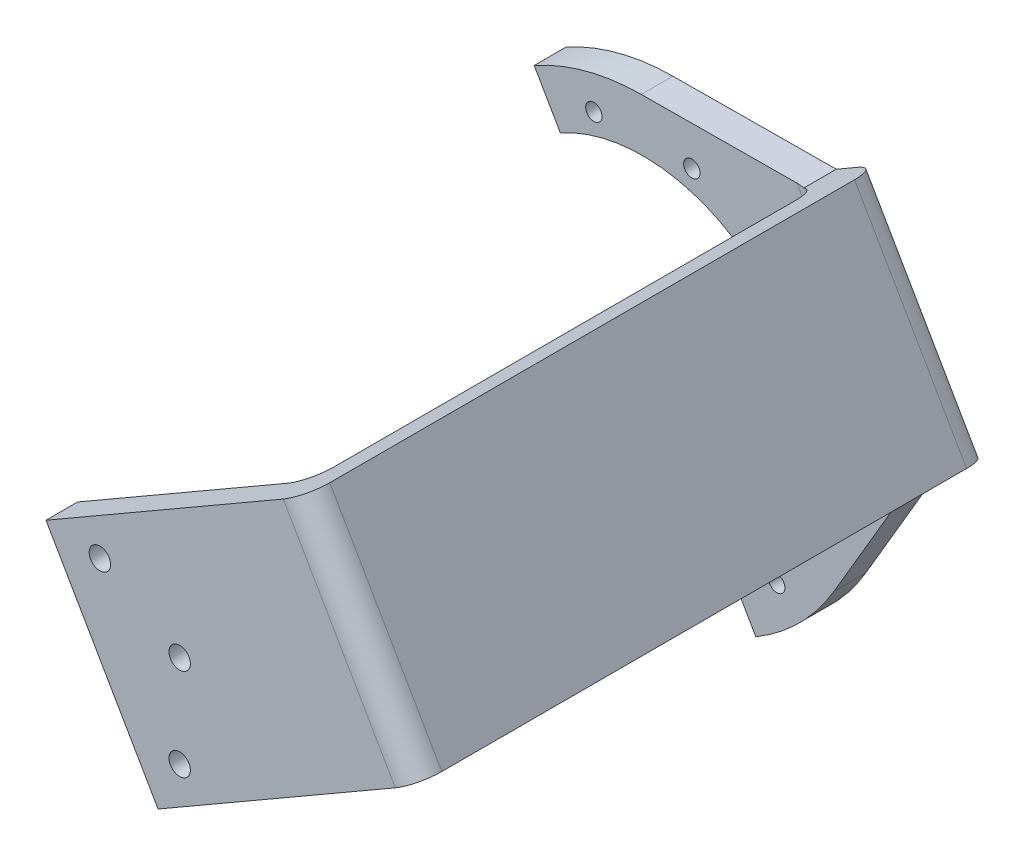
ISO-10303-21;
HEADER;
FILE_DESCRIPTION(('STEP AP214'),'2;1');
FILE_NAME('part.step','',(''),(''),'','','');
FILE_SCHEMA(('AUTOMOTIVE_DESIGN { 1 0 10303 214 1 1 1 1 }'));
ENDSEC;
DATA;
#1=APPLICATION_CONTEXT('core data for automotive mechanical design processes');
#2=APPLICATION_PROTOCOL_DEFINITION('international standard','automotive_design',2000,#1);
#3=PRODUCT_CONTEXT('',#1,'mechanical');
#4=PRODUCT('Part','Part','',(#3));
#5=PRODUCT_RELATED_PRODUCT_CATEGORY('part','',(#4));
#6=PRODUCT_DEFINITION_FORMATION('','',#4);
#7=PRODUCT_DEFINITION_CONTEXT('part definition',#1,'design');
#8=PRODUCT_DEFINITION('design','',#6,#7);
#9=PRODUCT_DEFINITION_SHAPE('','',#8);
#10=(LENGTH_UNIT() NAMED_UNIT(*) SI_UNIT(.MILLI.,.METRE.));
#11=(NAMED_UNIT(*) PLANE_ANGLE_UNIT() SI_UNIT($,.RADIAN.));
#12=(NAMED_UNIT(*) SI_UNIT($,.STERADIAN.) SOLID_ANGLE_UNIT());
#13=UNCERTAINTY_MEASURE_WITH_UNIT(LENGTH_MEASURE(1.E-05),#10,'distance_accuracy_value','');
#14=(GEOMETRIC_REPRESENTATION_CONTEXT(3) GLOBAL_UNCERTAINTY_ASSIGNED_CONTEXT((#13)) GLOBAL_UNIT_ASSIGNED_CONTEXT((#10,
#11,#12)) REPRESENTATION_CONTEXT('',''));
#15=CARTESIAN_POINT('',(0.,0.,0.));
#16=DIRECTION('',(0.,0.,1.));
#17=DIRECTION('',(1.,0.,0.));
#18=AXIS2_PLACEMENT_3D('',#15,#16,#17);
#19=CARTESIAN_POINT('',(0.433012701892224,0.250000000000003,115.35));
#20=DIRECTION('',(0.866025403784438,0.500000000000001,0.));
#21=DIRECTION('',(-0.500000000000001,0.866025403784438,0.));
#22=AXIS2_PLACEMENT_3D('',#19,#20,#21);
#23=PLANE('',#22);
#24=DIRECTION('',(0.500000000000001,-0.866025403784438,0.));
#25=VECTOR('',#24,1.);
#26=CARTESIAN_POINT('',(0.433012701892224,0.250000000000003,109.));
#27=LINE('',#26,#25);
#28=CARTESIAN_POINT('',(-10.8142091773098,19.7307597387781,109.));
#29=VERTEX_POINT('',#28);
#30=CARTESIAN_POINT('',(11.6802345810942,-19.2307597387781,109.));
#31=VERTEX_POINT('',#30);
#32=EDGE_CURVE('E310',#29,#31,#27,.T.);
#33=ORIENTED_EDGE('',*,*,#32,.T.);
#34=DIRECTION('',(0.,0.,-1.));
#35=VECTOR('',#34,1.);
#36=CARTESIAN_POINT('',(11.6802345810942,-19.2307597387781,115.35));
#37=LINE('',#36,#35);
#38=CARTESIAN_POINT('',(11.6802345810942,-19.2307597387781,115.35));
#39=VERTEX_POINT('',#38);
#40=EDGE_CURVE('E304',#39,#31,#37,.T.);
#41=ORIENTED_EDGE('',*,*,#40,.F.);
#42=DIRECTION('',(0.500000000000001,-0.866025403784438,0.));
#43=VECTOR('',#42,1.);
#44=CARTESIAN_POINT('',(0.433012701892224,0.250000000000003,115.35));
#45=LINE('',#44,#43);
#46=CARTESIAN_POINT('',(-10.8142091773098,19.7307597387781,115.35));
#47=VERTEX_POINT('',#46);
#48=EDGE_CURVE('E299',#47,#39,#45,.T.);
#49=ORIENTED_EDGE('',*,*,#48,.F.);
#50=DIRECTION('',(0.,0.,-1.));
#51=VECTOR('',#50,1.);
#52=CARTESIAN_POINT('',(-10.8142091773098,19.7307597387781,115.35));
#53=LINE('',#52,#51);
#54=EDGE_CURVE('E316',#47,#29,#53,.T.);
#55=ORIENTED_EDGE('',*,*,#54,.T.);
#56=EDGE_LOOP('',(#33,#41,#49,#55));
#57=FACE_BOUND('',#56,.T.);
#58=ADVANCED_FACE('F43',(#57),#23,.F.);
#59=CARTESIAN_POINT('',(0.,18.5,115.35));
#60=DIRECTION('',(0.,0.,-1.));
#61=DIRECTION('',(-1.,0.,0.));
#62=AXIS2_PLACEMENT_3D('',#59,#60,#61);
#63=CYLINDRICAL_SURFACE('',#62,2.15);
#64=CARTESIAN_POINT('',(0.,18.5,115.35));
#65=DIRECTION('',(0.,0.,1.));
#66=DIRECTION('',(1.,0.,0.));
#67=AXIS2_PLACEMENT_3D('',#64,#65,#66);
#68=CIRCLE('',#67,2.15);
#69=CARTESIAN_POINT('',(2.15,18.5,115.35));
#70=VERTEX_POINT('',#69);
#71=EDGE_CURVE('E295',#70,#70,#68,.T.);
#72=ORIENTED_EDGE('',*,*,#71,.T.);
#73=EDGE_LOOP('',(#72));
#74=FACE_BOUND('',#73,.T.);
#75=CARTESIAN_POINT('',(0.,18.5,109.));
#76=DIRECTION('',(0.,0.,1.));
#77=DIRECTION('',(1.,0.,0.));
#78=AXIS2_PLACEMENT_3D('',#75,#76,#77);
#79=CIRCLE('',#78,2.15);
#80=CARTESIAN_POINT('',(2.15,18.5,109.));
#81=VERTEX_POINT('',#80);
#82=EDGE_CURVE('E307',#81,#81,#79,.T.);
#83=ORIENTED_EDGE('',*,*,#82,.F.);
#84=EDGE_LOOP('',(#83));
#85=FACE_BOUND('',#84,.T.);
#86=ADVANCED_FACE('F436',(#74,#85),#63,.F.);
#87=CARTESIAN_POINT('',(16.0214699700121,9.25000000000002,115.35));
#88=DIRECTION('',(0.,0.,-1.));
#89=DIRECTION('',(-1.,0.,0.));
#90=AXIS2_PLACEMENT_3D('',#87,#88,#89);
#91=CYLINDRICAL_SURFACE('',#90,2.14999999999999);
#92=CARTESIAN_POINT('',(16.0214699700121,9.25000000000002,115.35));
#93=DIRECTION('',(0.,0.,1.));
#94=DIRECTION('',(1.,0.,0.));
#95=AXIS2_PLACEMENT_3D('',#92,#93,#94);
#96=CIRCLE('',#95,2.14999999999999);
#97=CARTESIAN_POINT('',(18.1714699700121,9.25000000000002,115.35));
#98=VERTEX_POINT('',#97);
#99=EDGE_CURVE('E292',#98,#98,#96,.T.);
#100=ORIENTED_EDGE('',*,*,#99,.T.);
#101=EDGE_LOOP('',(#100));
#102=FACE_BOUND('',#101,.T.);
#103=CARTESIAN_POINT('',(16.0214699700121,9.25000000000002,109.));
#104=DIRECTION('',(0.,0.,1.));
#105=DIRECTION('',(1.,0.,0.));
#106=AXIS2_PLACEMENT_3D('',#103,#104,#105);
#107=CIRCLE('',#106,2.14999999999999);
#108=CARTESIAN_POINT('',(18.1714699700121,9.25000000000002,109.));
#109=VERTEX_POINT('',#108);
#110=EDGE_CURVE('E288',#109,#109,#107,.T.);
#111=ORIENTED_EDGE('',*,*,#110,.F.);
#112=EDGE_LOOP('',(#111));
#113=FACE_BOUND('',#112,.T.);
#114=ADVANCED_FACE('F441',(#102,#113),#91,.F.);
#115=CARTESIAN_POINT('',(16.0214699700121,-9.25000000000002,115.35));
#116=DIRECTION('',(0.,0.,-1.));
#117=DIRECTION('',(-1.,0.,0.));
#118=AXIS2_PLACEMENT_3D('',#115,#116,#117);
#119=CYLINDRICAL_SURFACE('',#118,2.15);
#120=CARTESIAN_POINT('',(16.0214699700121,-9.25000000000002,115.35));
#121=DIRECTION('',(0.,0.,1.));
#122=DIRECTION('',(1.,0.,0.));
#123=AXIS2_PLACEMENT_3D('',#120,#121,#122);
#124=CIRCLE('',#123,2.15);
#125=CARTESIAN_POINT('',(18.1714699700121,-9.25000000000002,115.35));
#126=VERTEX_POINT('',#125);
#127=EDGE_CURVE('E301',#126,#126,#124,.T.);
#128=ORIENTED_EDGE('',*,*,#127,.T.);
#129=EDGE_LOOP('',(#128));
#130=FACE_BOUND('',#129,.T.);
#131=CARTESIAN_POINT('',(16.0214699700121,-9.25000000000002,109.));
#132=DIRECTION('',(0.,0.,1.));
#133=DIRECTION('',(1.,0.,0.));
#134=AXIS2_PLACEMENT_3D('',#131,#132,#133);
#135=CIRCLE('',#134,2.15);
#136=CARTESIAN_POINT('',(18.1714699700121,-9.25000000000002,109.));
#137=VERTEX_POINT('',#136);
#138=EDGE_CURVE('E296',#137,#137,#135,.T.);
#139=ORIENTED_EDGE('',*,*,#138,.F.);
#140=EDGE_LOOP('',(#139));
#141=FACE_BOUND('',#140,.T.);
#142=ADVANCED_FACE('F445',(#130,#141),#119,.F.);
#143=CARTESIAN_POINT('',(0.,0.,115.35));
#144=DIRECTION('',(0.,0.,1.));
#145=DIRECTION('',(1.,0.,0.));
#146=AXIS2_PLACEMENT_3D('',#143,#144,#145);
#147=PLANE('',#146);
#148=ORIENTED_EDGE('',*,*,#99,.F.);
#149=EDGE_LOOP('',(#148));
#150=FACE_BOUND('',#149,.T.);
#151=ORIENTED_EDGE('',*,*,#71,.F.);
#152=EDGE_LOOP('',(#151));
#153=FACE_BOUND('',#152,.T.);
#154=DIRECTION('',(0.866025403784438,0.500000000000002,0.));
#155=VECTOR('',#154,1.);
#156=CARTESIAN_POINT('',(11.247221879202,-19.4807597387781,115.35));
#157=LINE('',#156,#155);
#158=CARTESIAN_POINT('',(59.3116317892383,8.26924026122196,115.35));
#159=VERTEX_POINT('',#158);
#160=EDGE_CURVE('E282',#39,#159,#157,.T.);
#161=ORIENTED_EDGE('',*,*,#160,.T.);
#162=DIRECTION('',(0.500000000000002,-0.866025403784438,0.));
#163=VECTOR('',#162,1.);
#164=CARTESIAN_POINT('',(48.0644099100363,27.7500000000001,115.35));
#165=LINE('',#164,#163);
#166=CARTESIAN_POINT('',(36.8171880308343,47.2307597387782,115.35));
#167=VERTEX_POINT('',#166);
#168=EDGE_CURVE('E328',#159,#167,#165,.F.);
#169=ORIENTED_EDGE('',*,*,#168,.T.);
#170=DIRECTION('',(-0.866025403784438,-0.500000000000001,0.));
#171=VECTOR('',#170,1.);
#172=CARTESIAN_POINT('',(-11.247221879202,19.4807597387781,115.35));
#173=LINE('',#172,#171);
#174=EDGE_CURVE('E285',#167,#47,#173,.T.);
#175=ORIENTED_EDGE('',*,*,#174,.T.);
#176=ORIENTED_EDGE('',*,*,#48,.T.);
#177=EDGE_LOOP('',(#161,#169,#175,#176));
#178=FACE_BOUND('',#177,.T.);
#179=ORIENTED_EDGE('',*,*,#127,.F.);
#180=EDGE_LOOP('',(#179));
#181=FACE_BOUND('',#180,.T.);
#182=ADVANCED_FACE('F386',(#150,#153,#178,#181),#147,.T.);
#183=CARTESIAN_POINT('',(0.,0.,109.));
#184=DIRECTION('',(0.,0.,1.));
#185=DIRECTION('',(1.,0.,0.));
#186=AXIS2_PLACEMENT_3D('',#183,#184,#185);
#187=PLANE('',#186);
#188=ORIENTED_EDGE('',*,*,#110,.T.);
#189=EDGE_LOOP('',(#188));
#190=FACE_BOUND('',#189,.T.);
#191=ORIENTED_EDGE('',*,*,#82,.T.);
#192=EDGE_LOOP('',(#191));
#193=FACE_BOUND('',#192,.T.);
#194=DIRECTION('',(-0.866025403784438,-0.500000000000001,0.));
#195=VECTOR('',#194,1.);
#196=CARTESIAN_POINT('',(-11.247221879202,19.4807597387781,109.));
#197=LINE('',#196,#195);
#198=CARTESIAN_POINT('',(31.3179267168031,44.0557597387782,109.));
#199=VERTEX_POINT('',#198);
#200=EDGE_CURVE('E286',#199,#29,#197,.T.);
#201=ORIENTED_EDGE('',*,*,#200,.F.);
#202=DIRECTION('',(0.500000000000002,-0.866025403784438,0.));
#203=VECTOR('',#202,1.);
#204=CARTESIAN_POINT('',(42.5651485960051,24.5750000000001,109.));
#205=LINE('',#204,#203);
#206=CARTESIAN_POINT('',(53.8123704752072,5.09424026122196,109.));
#207=VERTEX_POINT('',#206);
#208=EDGE_CURVE('E334',#199,#207,#205,.T.);
#209=ORIENTED_EDGE('',*,*,#208,.T.);
#210=DIRECTION('',(0.866025403784438,0.500000000000002,0.));
#211=VECTOR('',#210,1.);
#212=CARTESIAN_POINT('',(11.247221879202,-19.4807597387781,109.));
#213=LINE('',#212,#211);
#214=EDGE_CURVE('E273',#31,#207,#213,.T.);
#215=ORIENTED_EDGE('',*,*,#214,.F.);
#216=ORIENTED_EDGE('',*,*,#32,.F.);
#217=EDGE_LOOP('',(#201,#209,#215,#216));
#218=FACE_BOUND('',#217,.T.);
#219=ORIENTED_EDGE('',*,*,#138,.T.);
#220=EDGE_LOOP('',(#219));
#221=FACE_BOUND('',#220,.T.);
#222=ADVANCED_FACE('F375',(#190,#193,#218,#221),#187,.F.);
#223=CARTESIAN_POINT('',(11.247221879202,-19.4807597387781,115.35));
#224=DIRECTION('',(-0.500000000000002,0.866025403784438,0.));
#225=DIRECTION('',(-0.866025403784438,-0.500000000000002,0.));
#226=AXIS2_PLACEMENT_3D('',#223,#224,#225);
#227=PLANE('',#226);
#228=DIRECTION('',(0.,0.,1.));
#229=VECTOR('',#228,1.);
#230=CARTESIAN_POINT('',(63.6417588081605,10.769240261222,115.35));
#231=LINE('',#230,#229);
#232=CARTESIAN_POINT('',(63.6417588081606,10.769240261222,5.00000000000003));
#233=VERTEX_POINT('',#232);
#234=CARTESIAN_POINT('',(63.6417588081605,10.769240261222,110.35));
#235=VERTEX_POINT('',#234);
#236=EDGE_CURVE('E266',#233,#235,#231,.T.);
#237=ORIENTED_EDGE('',*,*,#236,.T.);
#238=CARTESIAN_POINT('',(59.3116317892383,8.26924026122196,110.35));
#239=DIRECTION('',(-0.500000000000002,0.866025403784438,0.));
#240=DIRECTION('',(-0.866025403784438,-0.500000000000002,0.));
#241=AXIS2_PLACEMENT_3D('',#238,#239,#240);
#242=CIRCLE('',#241,5.);
#243=EDGE_CURVE('E326',#235,#159,#242,.F.);
#244=ORIENTED_EDGE('',*,*,#243,.T.);
#245=ORIENTED_EDGE('',*,*,#160,.F.);
#246=ORIENTED_EDGE('',*,*,#40,.T.);
#247=ORIENTED_EDGE('',*,*,#214,.T.);
#248=CARTESIAN_POINT('',(53.8123704752072,5.09424026122196,104.));
#249=DIRECTION('',(-0.500000000000002,0.866025403784438,0.));
#250=DIRECTION('',(-0.866025403784438,-0.500000000000002,0.));
#251=AXIS2_PLACEMENT_3D('',#248,#249,#250);
#252=CIRCLE('',#251,5.);
#253=CARTESIAN_POINT('',(58.1424974941294,7.59424026122196,104.));
#254=VERTEX_POINT('',#253);
#255=EDGE_CURVE('E347',#207,#254,#252,.T.);
#256=ORIENTED_EDGE('',*,*,#255,.T.);
#257=DIRECTION('',(0.,0.,-1.));
#258=VECTOR('',#257,1.);
#259=CARTESIAN_POINT('',(58.1424974941294,7.59424026122197,6.35));
#260=LINE('',#259,#258);
#261=CARTESIAN_POINT('',(58.1424974941294,7.59424026122197,11.35));
#262=VERTEX_POINT('',#261);
#263=EDGE_CURVE('E262',#254,#262,#260,.T.);
#264=ORIENTED_EDGE('',*,*,#263,.T.);
#265=CARTESIAN_POINT('',(53.8123704752072,5.09424026122196,11.35));
#266=DIRECTION('',(-0.500000000000002,0.866025403784438,0.));
#267=DIRECTION('',(-0.866025403784438,-0.500000000000002,0.));
#268=AXIS2_PLACEMENT_3D('',#265,#266,#267);
#269=CIRCLE('',#268,5.);
#270=CARTESIAN_POINT('',(54.9815047703162,5.76924026122195,6.53569838917417));
#271=VERTEX_POINT('',#270);
#272=EDGE_CURVE('E351',#262,#271,#269,.T.);
#273=ORIENTED_EDGE('',*,*,#272,.T.);
#274=DIRECTION('',(0.,0.,-1.));
#275=VECTOR('',#274,1.);
#276=CARTESIAN_POINT('',(54.9815047703162,5.76924026122195,0.));
#277=LINE('',#276,#275);
#278=CARTESIAN_POINT('',(54.9815047703161,5.76924026122195,0.));
#279=VERTEX_POINT('',#278);
#280=EDGE_CURVE('E65',#271,#279,#277,.T.);
#281=ORIENTED_EDGE('',*,*,#280,.T.);
#282=DIRECTION('',(0.866025403784438,0.500000000000002,0.));
#283=VECTOR('',#282,1.);
#284=CARTESIAN_POINT('',(63.6417588081606,10.769240261222,0.));
#285=LINE('',#284,#283);
#286=CARTESIAN_POINT('',(59.3116317892384,8.26924026122197,0.));
#287=VERTEX_POINT('',#286);
#288=EDGE_CURVE('E277',#279,#287,#285,.T.);
#289=ORIENTED_EDGE('',*,*,#288,.T.);
#290=CARTESIAN_POINT('',(59.3116317892384,8.26924026122198,5.));
#291=DIRECTION('',(-0.500000000000002,0.866025403784438,0.));
#292=DIRECTION('',(-0.866025403784438,-0.500000000000002,0.));
#293=AXIS2_PLACEMENT_3D('',#290,#291,#292);
#294=CIRCLE('',#293,5.);
#295=EDGE_CURVE('E324',#287,#233,#294,.F.);
#296=ORIENTED_EDGE('',*,*,#295,.T.);
#297=EDGE_LOOP('',(#237,#244,#245,#246,#247,#256,#264,#273,#281,#289,#296));
#298=FACE_BOUND('',#297,.T.);
#299=ADVANCED_FACE('F383',(#298),#227,.F.);
#300=CARTESIAN_POINT('',(-11.247221879202,19.4807597387781,115.35));
#301=DIRECTION('',(0.500000000000001,-0.866025403784438,0.));
#302=DIRECTION('',(0.866025403784438,0.500000000000001,0.));
#303=AXIS2_PLACEMENT_3D('',#300,#301,#302);
#304=PLANE('',#303);
#305=ORIENTED_EDGE('',*,*,#174,.F.);
#306=CARTESIAN_POINT('',(36.8171880308343,47.2307597387782,110.35));
#307=DIRECTION('',(0.500000000000001,-0.866025403784438,0.));
#308=DIRECTION('',(0.866025403784438,0.500000000000001,0.));
#309=AXIS2_PLACEMENT_3D('',#306,#307,#308);
#310=CIRCLE('',#309,5.);
#311=CARTESIAN_POINT('',(41.1473150497565,49.7307597387782,110.35));
#312=VERTEX_POINT('',#311);
#313=EDGE_CURVE('E332',#167,#312,#310,.F.);
#314=ORIENTED_EDGE('',*,*,#313,.T.);
#315=DIRECTION('',(0.,0.,1.));
#316=VECTOR('',#315,1.);
#317=CARTESIAN_POINT('',(41.1473150497565,49.7307597387782,115.35));
#318=LINE('',#317,#316);
#319=CARTESIAN_POINT('',(41.1473150497565,49.7307597387783,5.00000000000003));
#320=VERTEX_POINT('',#319);
#321=EDGE_CURVE('E270',#320,#312,#318,.T.);
#322=ORIENTED_EDGE('',*,*,#321,.F.);
#323=CARTESIAN_POINT('',(36.8171880308343,47.2307597387782,5.));
#324=DIRECTION('',(0.500000000000001,-0.866025403784438,0.));
#325=DIRECTION('',(0.866025403784438,0.500000000000001,0.));
#326=AXIS2_PLACEMENT_3D('',#323,#324,#325);
#327=CIRCLE('',#326,5.);
#328=CARTESIAN_POINT('',(36.8171880308343,47.2307597387782,0.));
#329=VERTEX_POINT('',#328);
#330=EDGE_CURVE('E330',#320,#329,#327,.F.);
#331=ORIENTED_EDGE('',*,*,#330,.T.);
#332=DIRECTION('',(0.866025403784438,0.500000000000002,0.));
#333=VECTOR('',#332,1.);
#334=CARTESIAN_POINT('',(41.1473150497565,49.7307597387783,0.));
#335=LINE('',#334,#333);
#336=CARTESIAN_POINT('',(32.4870610119121,44.7307597387782,0.));
#337=VERTEX_POINT('',#336);
#338=EDGE_CURVE('E268',#337,#329,#335,.T.);
#339=ORIENTED_EDGE('',*,*,#338,.F.);
#340=DIRECTION('',(0.,0.,-1.));
#341=VECTOR('',#340,1.);
#342=CARTESIAN_POINT('',(32.4870610119121,44.7307597387782,0.));
#343=LINE('',#342,#341);
#344=CARTESIAN_POINT('',(32.4870610119121,44.7307597387782,6.53569838917418));
#345=VERTEX_POINT('',#344);
#346=EDGE_CURVE('E57',#345,#337,#343,.T.);
#347=ORIENTED_EDGE('',*,*,#346,.F.);
#348=CARTESIAN_POINT('',(31.3179267168031,44.0557597387782,11.35));
#349=DIRECTION('',(0.500000000000001,-0.866025403784438,0.));
#350=DIRECTION('',(0.866025403784438,0.500000000000001,0.));
#351=AXIS2_PLACEMENT_3D('',#348,#349,#350);
#352=CIRCLE('',#351,5.);
#353=CARTESIAN_POINT('',(35.6480537357253,46.5557597387782,11.35));
#354=VERTEX_POINT('',#353);
#355=EDGE_CURVE('E11',#345,#354,#352,.T.);
#356=ORIENTED_EDGE('',*,*,#355,.T.);
#357=DIRECTION('',(0.,0.,-1.));
#358=VECTOR('',#357,1.);
#359=CARTESIAN_POINT('',(35.6480537357253,46.5557597387782,6.35));
#360=LINE('',#359,#358);
#361=CARTESIAN_POINT('',(35.6480537357253,46.5557597387782,104.));
#362=VERTEX_POINT('',#361);
#363=EDGE_CURVE('E263',#362,#354,#360,.T.);
#364=ORIENTED_EDGE('',*,*,#363,.F.);
#365=CARTESIAN_POINT('',(31.3179267168031,44.0557597387782,104.));
#366=DIRECTION('',(0.500000000000001,-0.866025403784438,0.));
#367=DIRECTION('',(0.866025403784438,0.500000000000001,0.));
#368=AXIS2_PLACEMENT_3D('',#365,#366,#367);
#369=CIRCLE('',#368,5.);
#370=EDGE_CURVE('E349',#362,#199,#369,.T.);
#371=ORIENTED_EDGE('',*,*,#370,.T.);
#372=ORIENTED_EDGE('',*,*,#200,.T.);
#373=ORIENTED_EDGE('',*,*,#54,.F.);
#374=EDGE_LOOP('',(#305,#314,#322,#331,#339,#347,#356,#364,#371,#372,#373));
#375=FACE_BOUND('',#374,.T.);
#376=ADVANCED_FACE('F362',(#375),#304,.F.);
#377=CARTESIAN_POINT('',(41.1473150497565,49.7307597387782,115.35));
#378=DIRECTION('',(0.866025403784438,0.500000000000002,0.));
#379=DIRECTION('',(-0.500000000000002,0.866025403784438,0.));
#380=AXIS2_PLACEMENT_3D('',#377,#378,#379);
#381=PLANE('',#380);
#382=ORIENTED_EDGE('',*,*,#321,.T.);
#383=DIRECTION('',(0.500000000000002,-0.866025403784438,0.));
#384=VECTOR('',#383,1.);
#385=CARTESIAN_POINT('',(41.1473150497565,49.7307597387782,110.35));
#386=LINE('',#385,#384);
#387=EDGE_CURVE('E321',#312,#235,#386,.T.);
#388=ORIENTED_EDGE('',*,*,#387,.T.);
#389=ORIENTED_EDGE('',*,*,#236,.F.);
#390=DIRECTION('',(0.500000000000002,-0.866025403784438,0.));
#391=VECTOR('',#390,1.);
#392=CARTESIAN_POINT('',(41.1473150497565,49.7307597387783,5.));
#393=LINE('',#392,#391);
#394=EDGE_CURVE('E319',#233,#320,#393,.F.);
#395=ORIENTED_EDGE('',*,*,#394,.T.);
#396=EDGE_LOOP('',(#382,#388,#389,#395));
#397=FACE_BOUND('',#396,.T.);
#398=ADVANCED_FACE('F395',(#397),#381,.T.);
#399=CARTESIAN_POINT('',(41.1473150497565,49.7307597387783,0.));
#400=DIRECTION('',(0.,0.,-1.));
#401=DIRECTION('',(-1.,0.,0.));
#402=AXIS2_PLACEMENT_3D('',#399,#400,#401);
#403=PLANE('',#402);
#404=ORIENTED_EDGE('',*,*,#338,.T.);
#405=DIRECTION('',(0.500000000000002,-0.866025403784438,0.));
#406=VECTOR('',#405,1.);
#407=CARTESIAN_POINT('',(36.8171880308343,47.2307597387782,0.));
#408=LINE('',#407,#406);
#409=EDGE_CURVE('E344',#329,#287,#408,.T.);
#410=ORIENTED_EDGE('',*,*,#409,.T.);
#411=ORIENTED_EDGE('',*,*,#288,.F.);
#412=DIRECTION('',(-0.50610920608183,-0.862469403236555,0.));
#413=VECTOR('',#412,1.);
#414=CARTESIAN_POINT('',(38.3798884440267,-22.5218596706414,0.));
#415=LINE('',#414,#413);
#416=CARTESIAN_POINT('',(38.3798884440267,-22.5218596706415,0.));
#417=VERTEX_POINT('',#416);
#418=EDGE_CURVE('E194',#279,#417,#415,.T.);
#419=ORIENTED_EDGE('',*,*,#418,.T.);
#420=CARTESIAN_POINT('',(0.,0.,0.));
#421=DIRECTION('',(0.,0.,1.));
#422=DIRECTION('',(1.,0.,0.));
#423=AXIS2_PLACEMENT_3D('',#420,#421,#422);
#424=CIRCLE('',#423,44.5);
#425=CARTESIAN_POINT('',(22.6816081631793,-38.2856977359954,0.));
#426=VERTEX_POINT('',#425);
#427=EDGE_CURVE('E180',#426,#417,#424,.T.);
#428=ORIENTED_EDGE('',*,*,#427,.F.);
#429=DIRECTION('',(-0.500000000000001,0.866025403784438,0.));
#430=VECTOR('',#429,1.);
#431=CARTESIAN_POINT('',(0.433012701892228,0.250000000000006,0.));
#432=LINE('',#431,#430);
#433=CARTESIAN_POINT('',(17.4311743672019,-29.1916796395858,0.));
#434=VERTEX_POINT('',#433);
#435=EDGE_CURVE('E181',#426,#434,#432,.T.);
#436=ORIENTED_EDGE('',*,*,#435,.T.);
#437=CARTESIAN_POINT('',(0.,0.,0.));
#438=DIRECTION('',(0.,0.,1.));
#439=DIRECTION('',(1.,0.,0.));
#440=AXIS2_PLACEMENT_3D('',#437,#438,#439);
#441=CIRCLE('',#440,34.);
#442=CARTESIAN_POINT('',(-16.5651489634174,29.6916796395858,0.));
#443=VERTEX_POINT('',#442);
#444=EDGE_CURVE('E250',#434,#443,#441,.T.);
#445=ORIENTED_EDGE('',*,*,#444,.T.);
#446=CARTESIAN_POINT('',(-21.8155827593948,38.7856977359954,0.));
#447=VERTEX_POINT('',#446);
#448=EDGE_CURVE('E176',#443,#447,#432,.T.);
#449=ORIENTED_EDGE('',*,*,#448,.T.);
#450=CARTESIAN_POINT('',(-0.314558393230516,44.4988882222607,0.));
#451=VERTEX_POINT('',#450);
#452=EDGE_CURVE('E167',#451,#447,#424,.T.);
#453=ORIENTED_EDGE('',*,*,#452,.F.);
#454=DIRECTION('',(-0.999975016230577,-0.00706872793776382,0.));
#455=VECTOR('',#454,1.);
#456=CARTESIAN_POINT('',(-0.31455839323049,44.4988882222607,0.));
#457=LINE('',#456,#455);
#458=EDGE_CURVE('E173',#337,#451,#457,.T.);
#459=ORIENTED_EDGE('',*,*,#458,.F.);
#460=EDGE_LOOP('',(#404,#410,#411,#419,#428,#436,#445,#449,#453,#459));
#461=FACE_BOUND('',#460,.T.);
#462=CARTESIAN_POINT('',(-9.83512371389604,36.7051813989845,0.));
#463=DIRECTION('',(0.,0.,1.));
#464=DIRECTION('',(1.,0.,0.));
#465=AXIS2_PLACEMENT_3D('',#462,#463,#464);
#466=CIRCLE('',#465,1.65);
#467=CARTESIAN_POINT('',(-8.18512371389604,36.7051813989845,0.));
#468=VERTEX_POINT('',#467);
#469=EDGE_CURVE('E190',#468,#468,#466,.T.);
#470=ORIENTED_EDGE('',*,*,#469,.T.);
#471=EDGE_LOOP('',(#470));
#472=FACE_BOUND('',#471,.T.);
#473=CARTESIAN_POINT('',(26.870057685089,-26.8700576850886,0.));
#474=DIRECTION('',(0.,0.,1.));
#475=DIRECTION('',(1.,0.,0.));
#476=AXIS2_PLACEMENT_3D('',#473,#474,#475);
#477=CIRCLE('',#476,1.65);
#478=CARTESIAN_POINT('',(28.520057685089,-26.8700576850886,0.));
#479=VERTEX_POINT('',#478);
#480=EDGE_CURVE('E235',#479,#479,#477,.T.);
#481=ORIENTED_EDGE('',*,*,#480,.T.);
#482=EDGE_LOOP('',(#481));
#483=FACE_BOUND('',#482,.T.);
#484=CARTESIAN_POINT('',(36.7051813989847,-9.83512371389555,0.));
#485=DIRECTION('',(0.,0.,1.));
#486=DIRECTION('',(1.,0.,0.));
#487=AXIS2_PLACEMENT_3D('',#484,#485,#486);
#488=CIRCLE('',#487,1.64999999999999);
#489=CARTESIAN_POINT('',(38.3551813989847,-9.83512371389555,0.));
#490=VERTEX_POINT('',#489);
#491=EDGE_CURVE('E238',#490,#490,#488,.T.);
#492=ORIENTED_EDGE('',*,*,#491,.T.);
#493=EDGE_LOOP('',(#492));
#494=FACE_BOUND('',#493,.T.);
#495=CARTESIAN_POINT('',(36.7051813989845,9.83512371389603,0.));
#496=DIRECTION('',(0.,0.,1.));
#497=DIRECTION('',(1.,0.,0.));
#498=AXIS2_PLACEMENT_3D('',#495,#496,#497);
#499=CIRCLE('',#498,1.65);
#500=CARTESIAN_POINT('',(38.3551813989845,9.83512371389603,0.));
#501=VERTEX_POINT('',#500);
#502=EDGE_CURVE('E241',#501,#501,#499,.T.);
#503=ORIENTED_EDGE('',*,*,#502,.T.);
#504=EDGE_LOOP('',(#503));
#505=FACE_BOUND('',#504,.T.);
#506=CARTESIAN_POINT('',(26.8700576850886,26.870057685089,0.));
#507=DIRECTION('',(0.,0.,1.));
#508=DIRECTION('',(1.,0.,0.));
#509=AXIS2_PLACEMENT_3D('',#506,#507,#508);
#510=CIRCLE('',#509,1.65);
#511=CARTESIAN_POINT('',(28.5200576850886,26.870057685089,0.));
#512=VERTEX_POINT('',#511);
#513=EDGE_CURVE('E244',#512,#512,#510,.T.);
#514=ORIENTED_EDGE('',*,*,#513,.T.);
#515=EDGE_LOOP('',(#514));
#516=FACE_BOUND('',#515,.T.);
#517=CARTESIAN_POINT('',(9.83512371389555,36.7051813989847,0.));
#518=DIRECTION('',(0.,0.,1.));
#519=DIRECTION('',(1.,0.,0.));
#520=AXIS2_PLACEMENT_3D('',#517,#518,#519);
#521=CIRCLE('',#520,1.65);
#522=CARTESIAN_POINT('',(11.4851237138955,36.7051813989847,0.));
#523=VERTEX_POINT('',#522);
#524=EDGE_CURVE('E247',#523,#523,#521,.T.);
#525=ORIENTED_EDGE('',*,*,#524,.T.);
#526=EDGE_LOOP('',(#525));
#527=FACE_BOUND('',#526,.T.);
#528=ADVANCED_FACE('F170',(#461,#472,#483,#494,#505,#516,#527),#403,.T.);
#529=CARTESIAN_POINT('',(32.4870610119121,44.7307597387782,6.35));
#530=DIRECTION('',(0.,0.,1.));
#531=DIRECTION('',(1.,0.,0.));
#532=AXIS2_PLACEMENT_3D('',#529,#530,#531);
#533=PLANE('',#532);
#534=DIRECTION('',(-0.50610920608183,-0.862469403236555,0.));
#535=VECTOR('',#534,1.);
#536=CARTESIAN_POINT('',(38.3798884440267,-22.5218596706414,6.35));
#537=LINE('',#536,#535);
#538=CARTESIAN_POINT('',(54.195745752149,4.430214803193,6.35));
#539=VERTEX_POINT('',#538);
#540=CARTESIAN_POINT('',(38.3798884440267,-22.5218596706415,6.35));
#541=VERTEX_POINT('',#540);
#542=EDGE_CURVE('E200',#539,#541,#537,.T.);
#543=ORIENTED_EDGE('',*,*,#542,.F.);
#544=DIRECTION('',(0.500000000000002,-0.866025403784438,0.));
#545=VECTOR('',#544,1.);
#546=CARTESIAN_POINT('',(31.3179267168031,44.0557597387782,6.35));
#547=LINE('',#546,#545);
#548=CARTESIAN_POINT('',(30.9345514398614,44.7197851968072,6.35));
#549=VERTEX_POINT('',#548);
#550=EDGE_CURVE('E342',#539,#549,#547,.F.);
#551=ORIENTED_EDGE('',*,*,#550,.T.);
#552=DIRECTION('',(-0.999975016230577,-0.00706872793776382,0.));
#553=VECTOR('',#552,1.);
#554=CARTESIAN_POINT('',(-0.31455839323049,44.4988882222607,6.35));
#555=LINE('',#554,#553);
#556=CARTESIAN_POINT('',(-0.314558393230516,44.4988882222607,6.35));
#557=VERTEX_POINT('',#556);
#558=EDGE_CURVE('E197',#549,#557,#555,.T.);
#559=ORIENTED_EDGE('',*,*,#558,.T.);
#560=CARTESIAN_POINT('',(0.,0.,6.35));
#561=DIRECTION('',(0.,0.,1.));
#562=DIRECTION('',(1.,0.,0.));
#563=AXIS2_PLACEMENT_3D('',#560,#561,#562);
#564=CIRCLE('',#563,44.5);
#565=CARTESIAN_POINT('',(-21.8155827593948,38.7856977359954,6.35));
#566=VERTEX_POINT('',#565);
#567=EDGE_CURVE('E187',#557,#566,#564,.T.);
#568=ORIENTED_EDGE('',*,*,#567,.T.);
#569=DIRECTION('',(-0.500000000000001,0.866025403784438,0.));
#570=VECTOR('',#569,1.);
#571=CARTESIAN_POINT('',(0.433012701892228,0.250000000000006,6.35));
#572=LINE('',#571,#570);
#573=CARTESIAN_POINT('',(-16.5651489634174,29.6916796395858,6.35));
#574=VERTEX_POINT('',#573);
#575=EDGE_CURVE('E229',#574,#566,#572,.T.);
#576=ORIENTED_EDGE('',*,*,#575,.F.);
#577=CARTESIAN_POINT('',(0.,0.,6.35));
#578=DIRECTION('',(0.,0.,1.));
#579=DIRECTION('',(1.,0.,0.));
#580=AXIS2_PLACEMENT_3D('',#577,#578,#579);
#581=CIRCLE('',#580,34.);
#582=CARTESIAN_POINT('',(17.4311743672019,-29.1916796395858,6.35));
#583=VERTEX_POINT('',#582);
#584=EDGE_CURVE('E223',#583,#574,#581,.T.);
#585=ORIENTED_EDGE('',*,*,#584,.F.);
#586=CARTESIAN_POINT('',(22.6816081631793,-38.2856977359954,6.35));
#587=VERTEX_POINT('',#586);
#588=EDGE_CURVE('E226',#587,#583,#572,.T.);
#589=ORIENTED_EDGE('',*,*,#588,.F.);
#590=EDGE_CURVE('E230',#587,#541,#564,.T.);
#591=ORIENTED_EDGE('',*,*,#590,.T.);
#592=EDGE_LOOP('',(#543,#551,#559,#568,#576,#585,#589,#591));
#593=FACE_BOUND('',#592,.T.);
#594=CARTESIAN_POINT('',(-9.83512371389604,36.7051813989845,6.35));
#595=DIRECTION('',(0.,0.,1.));
#596=DIRECTION('',(1.,0.,0.));
#597=AXIS2_PLACEMENT_3D('',#594,#595,#596);
#598=CIRCLE('',#597,1.65);
#599=CARTESIAN_POINT('',(-8.18512371389604,36.7051813989845,6.35));
#600=VERTEX_POINT('',#599);
#601=EDGE_CURVE('E205',#600,#600,#598,.T.);
#602=ORIENTED_EDGE('',*,*,#601,.F.);
#603=EDGE_LOOP('',(#602));
#604=FACE_BOUND('',#603,.T.);
#605=CARTESIAN_POINT('',(26.870057685089,-26.8700576850886,6.35));
#606=DIRECTION('',(0.,0.,1.));
#607=DIRECTION('',(1.,0.,0.));
#608=AXIS2_PLACEMENT_3D('',#605,#606,#607);
#609=CIRCLE('',#608,1.65);
#610=CARTESIAN_POINT('',(28.520057685089,-26.8700576850886,6.35));
#611=VERTEX_POINT('',#610);
#612=EDGE_CURVE('E208',#611,#611,#609,.T.);
#613=ORIENTED_EDGE('',*,*,#612,.F.);
#614=EDGE_LOOP('',(#613));
#615=FACE_BOUND('',#614,.T.);
#616=CARTESIAN_POINT('',(36.7051813989847,-9.83512371389555,6.35));
#617=DIRECTION('',(0.,0.,1.));
#618=DIRECTION('',(1.,0.,0.));
#619=AXIS2_PLACEMENT_3D('',#616,#617,#618);
#620=CIRCLE('',#619,1.64999999999999);
#621=CARTESIAN_POINT('',(38.3551813989847,-9.83512371389555,6.35));
#622=VERTEX_POINT('',#621);
#623=EDGE_CURVE('E211',#622,#622,#620,.T.);
#624=ORIENTED_EDGE('',*,*,#623,.F.);
#625=EDGE_LOOP('',(#624));
#626=FACE_BOUND('',#625,.T.);
#627=CARTESIAN_POINT('',(36.7051813989845,9.83512371389603,6.35));
#628=DIRECTION('',(0.,0.,1.));
#629=DIRECTION('',(1.,0.,0.));
#630=AXIS2_PLACEMENT_3D('',#627,#628,#629);
#631=CIRCLE('',#630,1.65);
#632=CARTESIAN_POINT('',(38.3551813989845,9.83512371389603,6.35));
#633=VERTEX_POINT('',#632);
#634=EDGE_CURVE('E214',#633,#633,#631,.T.);
#635=ORIENTED_EDGE('',*,*,#634,.F.);
#636=EDGE_LOOP('',(#635));
#637=FACE_BOUND('',#636,.T.);
#638=CARTESIAN_POINT('',(26.8700576850886,26.870057685089,6.35));
#639=DIRECTION('',(0.,0.,1.));
#640=DIRECTION('',(1.,0.,0.));
#641=AXIS2_PLACEMENT_3D('',#638,#639,#640);
#642=CIRCLE('',#641,1.65);
#643=CARTESIAN_POINT('',(28.5200576850886,26.870057685089,6.35));
#644=VERTEX_POINT('',#643);
#645=EDGE_CURVE('E217',#644,#644,#642,.T.);
#646=ORIENTED_EDGE('',*,*,#645,.F.);
#647=EDGE_LOOP('',(#646));
#648=FACE_BOUND('',#647,.T.);
#649=CARTESIAN_POINT('',(9.83512371389555,36.7051813989847,6.35));
#650=DIRECTION('',(0.,0.,1.));
#651=DIRECTION('',(1.,0.,0.));
#652=AXIS2_PLACEMENT_3D('',#649,#650,#651);
#653=CIRCLE('',#652,1.65);
#654=CARTESIAN_POINT('',(11.4851237138955,36.7051813989847,6.35));
#655=VERTEX_POINT('',#654);
#656=EDGE_CURVE('E220',#655,#655,#653,.T.);
#657=ORIENTED_EDGE('',*,*,#656,.F.);
#658=EDGE_LOOP('',(#657));
#659=FACE_BOUND('',#658,.T.);
#660=ADVANCED_FACE('F406',(#593,#604,#615,#626,#637,#648,#659),#533,.T.);
#661=CARTESIAN_POINT('',(35.6480537357253,46.5557597387782,6.35));
#662=DIRECTION('',(-0.866025403784438,-0.500000000000002,0.));
#663=DIRECTION('',(0.500000000000002,-0.866025403784438,0.));
#664=AXIS2_PLACEMENT_3D('',#661,#662,#663);
#665=PLANE('',#664);
#666=ORIENTED_EDGE('',*,*,#263,.F.);
#667=DIRECTION('',(0.500000000000002,-0.866025403784438,0.));
#668=VECTOR('',#667,1.);
#669=CARTESIAN_POINT('',(35.6480537357253,46.5557597387782,104.));
#670=LINE('',#669,#668);
#671=EDGE_CURVE('E340',#254,#362,#670,.F.);
#672=ORIENTED_EDGE('',*,*,#671,.T.);
#673=ORIENTED_EDGE('',*,*,#363,.T.);
#674=DIRECTION('',(0.500000000000002,-0.866025403784438,0.));
#675=VECTOR('',#674,1.);
#676=CARTESIAN_POINT('',(58.1424974941294,7.59424026122195,11.35));
#677=LINE('',#676,#675);
#678=EDGE_CURVE('E337',#354,#262,#677,.T.);
#679=ORIENTED_EDGE('',*,*,#678,.T.);
#680=EDGE_LOOP('',(#666,#672,#673,#679));
#681=FACE_BOUND('',#680,.T.);
#682=ADVANCED_FACE('F366',(#681),#665,.T.);
#683=CARTESIAN_POINT('',(0.,0.,6.35));
#684=DIRECTION('',(0.,0.,-1.));
#685=DIRECTION('',(-1.,0.,0.));
#686=AXIS2_PLACEMENT_3D('',#683,#684,#685);
#687=CYLINDRICAL_SURFACE('',#686,44.5);
#688=DIRECTION('',(0.,0.,-1.));
#689=VECTOR('',#688,1.);
#690=CARTESIAN_POINT('',(38.3798884440267,-22.5218596706414,6.35));
#691=LINE('',#690,#689);
#692=EDGE_CURVE('E191',#541,#417,#691,.T.);
#693=ORIENTED_EDGE('',*,*,#692,.F.);
#694=ORIENTED_EDGE('',*,*,#590,.F.);
#695=DIRECTION('',(0.,0.,-1.));
#696=VECTOR('',#695,1.);
#697=CARTESIAN_POINT('',(22.6816081631793,-38.2856977359954,6.35));
#698=LINE('',#697,#696);
#699=EDGE_CURVE('E258',#587,#426,#698,.T.);
#700=ORIENTED_EDGE('',*,*,#699,.T.);
#701=ORIENTED_EDGE('',*,*,#427,.T.);
#702=EDGE_LOOP('',(#693,#694,#700,#701));
#703=FACE_BOUND('',#702,.T.);
#704=ADVANCED_FACE('F423',(#703),#687,.T.);
#705=CARTESIAN_POINT('',(0.,0.,6.35));
#706=DIRECTION('',(0.,0.,-1.));
#707=DIRECTION('',(-1.,0.,0.));
#708=AXIS2_PLACEMENT_3D('',#705,#706,#707);
#709=CYLINDRICAL_SURFACE('',#708,34.);
#710=ORIENTED_EDGE('',*,*,#444,.F.);
#711=DIRECTION('',(0.,0.,-1.));
#712=VECTOR('',#711,1.);
#713=CARTESIAN_POINT('',(17.4311743672019,-29.1916796395858,6.35));
#714=LINE('',#713,#712);
#715=EDGE_CURVE('E260',#583,#434,#714,.T.);
#716=ORIENTED_EDGE('',*,*,#715,.F.);
#717=ORIENTED_EDGE('',*,*,#584,.T.);
#718=DIRECTION('',(0.,0.,-1.));
#719=VECTOR('',#718,1.);
#720=CARTESIAN_POINT('',(-16.5651489634174,29.6916796395858,6.35));
#721=LINE('',#720,#719);
#722=EDGE_CURVE('E254',#574,#443,#721,.T.);
#723=ORIENTED_EDGE('',*,*,#722,.T.);
#724=EDGE_LOOP('',(#710,#716,#717,#723));
#725=FACE_BOUND('',#724,.T.);
#726=ADVANCED_FACE('F417',(#725),#709,.F.);
#727=CARTESIAN_POINT('',(0.433012701892228,0.250000000000006,6.35));
#728=DIRECTION('',(-0.866025403784438,-0.500000000000001,0.));
#729=DIRECTION('',(0.500000000000001,-0.866025403784438,0.));
#730=AXIS2_PLACEMENT_3D('',#727,#728,#729);
#731=PLANE('',#730);
#732=ORIENTED_EDGE('',*,*,#435,.F.);
#733=ORIENTED_EDGE('',*,*,#699,.F.);
#734=ORIENTED_EDGE('',*,*,#588,.T.);
#735=ORIENTED_EDGE('',*,*,#715,.T.);
#736=EDGE_LOOP('',(#732,#733,#734,#735));
#737=FACE_BOUND('',#736,.T.);
#738=ADVANCED_FACE('F420',(#737),#731,.T.);
#739=ORIENTED_EDGE('',*,*,#567,.F.);
#740=DIRECTION('',(0.,0.,-1.));
#741=VECTOR('',#740,1.);
#742=CARTESIAN_POINT('',(-0.314558393230516,44.4988882222607,6.35));
#743=LINE('',#742,#741);
#744=EDGE_CURVE('E185',#557,#451,#743,.T.);
#745=ORIENTED_EDGE('',*,*,#744,.T.);
#746=ORIENTED_EDGE('',*,*,#452,.T.);
#747=DIRECTION('',(0.,0.,-1.));
#748=VECTOR('',#747,1.);
#749=CARTESIAN_POINT('',(-21.8155827593948,38.7856977359954,6.35));
#750=LINE('',#749,#748);
#751=EDGE_CURVE('E256',#566,#447,#750,.T.);
#752=ORIENTED_EDGE('',*,*,#751,.F.);
#753=EDGE_LOOP('',(#739,#745,#746,#752));
#754=FACE_BOUND('',#753,.T.);
#755=ADVANCED_FACE('F186',(#754),#687,.T.);
#756=CARTESIAN_POINT('',(9.83512371389555,36.7051813989847,6.35));
#757=DIRECTION('',(0.,0.,-1.));
#758=DIRECTION('',(-1.,0.,0.));
#759=AXIS2_PLACEMENT_3D('',#756,#757,#758);
#760=CYLINDRICAL_SURFACE('',#759,1.65);
#761=ORIENTED_EDGE('',*,*,#656,.T.);
#762=EDGE_LOOP('',(#761));
#763=FACE_BOUND('',#762,.T.);
#764=ORIENTED_EDGE('',*,*,#524,.F.);
#765=EDGE_LOOP('',(#764));
#766=FACE_BOUND('',#765,.T.);
#767=ADVANCED_FACE('F434',(#763,#766),#760,.F.);
#768=CARTESIAN_POINT('',(26.8700576850886,26.870057685089,6.35));
#769=DIRECTION('',(0.,0.,-1.));
#770=DIRECTION('',(-1.,0.,0.));
#771=AXIS2_PLACEMENT_3D('',#768,#769,#770);
#772=CYLINDRICAL_SURFACE('',#771,1.65);
#773=ORIENTED_EDGE('',*,*,#645,.T.);
#774=EDGE_LOOP('',(#773));
#775=FACE_BOUND('',#774,.T.);
#776=ORIENTED_EDGE('',*,*,#513,.F.);
#777=EDGE_LOOP('',(#776));
#778=FACE_BOUND('',#777,.T.);
#779=ADVANCED_FACE('F629',(#775,#778),#772,.F.);
#780=CARTESIAN_POINT('',(36.7051813989845,9.83512371389603,6.35));
#781=DIRECTION('',(0.,0.,-1.));
#782=DIRECTION('',(-1.,0.,0.));
#783=AXIS2_PLACEMENT_3D('',#780,#781,#782);
#784=CYLINDRICAL_SURFACE('',#783,1.65);
#785=ORIENTED_EDGE('',*,*,#634,.T.);
#786=EDGE_LOOP('',(#785));
#787=FACE_BOUND('',#786,.T.);
#788=ORIENTED_EDGE('',*,*,#502,.F.);
#789=EDGE_LOOP('',(#788));
#790=FACE_BOUND('',#789,.T.);
#791=ADVANCED_FACE('F616',(#787,#790),#784,.F.);
#792=CARTESIAN_POINT('',(36.7051813989847,-9.83512371389555,6.35));
#793=DIRECTION('',(0.,0.,-1.));
#794=DIRECTION('',(-1.,0.,0.));
#795=AXIS2_PLACEMENT_3D('',#792,#793,#794);
#796=CYLINDRICAL_SURFACE('',#795,1.64999999999999);
#797=ORIENTED_EDGE('',*,*,#623,.T.);
#798=EDGE_LOOP('',(#797));
#799=FACE_BOUND('',#798,.T.);
#800=ORIENTED_EDGE('',*,*,#491,.F.);
#801=EDGE_LOOP('',(#800));
#802=FACE_BOUND('',#801,.T.);
#803=ADVANCED_FACE('F604',(#799,#802),#796,.F.);
#804=CARTESIAN_POINT('',(26.870057685089,-26.8700576850886,6.35));
#805=DIRECTION('',(0.,0.,-1.));
#806=DIRECTION('',(-1.,0.,0.));
#807=AXIS2_PLACEMENT_3D('',#804,#805,#806);
#808=CYLINDRICAL_SURFACE('',#807,1.65);
#809=ORIENTED_EDGE('',*,*,#612,.T.);
#810=EDGE_LOOP('',(#809));
#811=FACE_BOUND('',#810,.T.);
#812=ORIENTED_EDGE('',*,*,#480,.F.);
#813=EDGE_LOOP('',(#812));
#814=FACE_BOUND('',#813,.T.);
#815=ADVANCED_FACE('F590',(#811,#814),#808,.F.);
#816=CARTESIAN_POINT('',(-9.83512371389604,36.7051813989845,6.35));
#817=DIRECTION('',(0.,0.,-1.));
#818=DIRECTION('',(-1.,0.,0.));
#819=AXIS2_PLACEMENT_3D('',#816,#817,#818);
#820=CYLINDRICAL_SURFACE('',#819,1.65);
#821=ORIENTED_EDGE('',*,*,#601,.T.);
#822=EDGE_LOOP('',(#821));
#823=FACE_BOUND('',#822,.T.);
#824=ORIENTED_EDGE('',*,*,#469,.F.);
#825=EDGE_LOOP('',(#824));
#826=FACE_BOUND('',#825,.T.);
#827=ADVANCED_FACE('F581',(#823,#826),#820,.F.);
#828=ORIENTED_EDGE('',*,*,#448,.F.);
#829=ORIENTED_EDGE('',*,*,#722,.F.);
#830=ORIENTED_EDGE('',*,*,#575,.T.);
#831=ORIENTED_EDGE('',*,*,#751,.T.);
#832=EDGE_LOOP('',(#828,#829,#830,#831));
#833=FACE_BOUND('',#832,.T.);
#834=ADVANCED_FACE('F414',(#833),#731,.T.);
#835=CARTESIAN_POINT('',(-0.31455839323049,44.4988882222607,6.35));
#836=DIRECTION('',(0.00706872793776382,-0.999975016230577,0.));
#837=DIRECTION('',(0.999975016230577,0.00706872793776382,0.));
#838=AXIS2_PLACEMENT_3D('',#835,#836,#837);
#839=PLANE('',#838);
#840=ORIENTED_EDGE('',*,*,#458,.T.);
#841=ORIENTED_EDGE('',*,*,#744,.F.);
#842=ORIENTED_EDGE('',*,*,#558,.F.);
#843=CARTESIAN_POINT('',(30.9345514398613,44.7197851968072,11.35));
#844=DIRECTION('',(0.00706872793776382,-0.999975016230577,0.));
#845=DIRECTION('',(-0.999975016230577,-0.00706872793776382,0.));
#846=AXIS2_PLACEMENT_3D('',#843,#844,#845);
#847=ELLIPSE('',#846,5.75017911318905,5.);
#848=EDGE_CURVE('E51',#549,#345,#847,.T.);
#849=ORIENTED_EDGE('',*,*,#848,.T.);
#850=ORIENTED_EDGE('',*,*,#346,.T.);
#851=EDGE_LOOP('',(#840,#841,#842,#849,#850));
#852=FACE_BOUND('',#851,.T.);
#853=ADVANCED_FACE('F193',(#852),#839,.F.);
#854=CARTESIAN_POINT('',(38.3798884440267,-22.5218596706414,6.35));
#855=DIRECTION('',(0.862469403236555,-0.50610920608183,0.));
#856=DIRECTION('',(0.50610920608183,0.862469403236555,0.));
#857=AXIS2_PLACEMENT_3D('',#854,#855,#856);
#858=PLANE('',#857);
#859=ORIENTED_EDGE('',*,*,#418,.F.);
#860=ORIENTED_EDGE('',*,*,#280,.F.);
#861=CARTESIAN_POINT('',(54.195745752149,4.43021480319301,11.35));
#862=DIRECTION('',(0.862469403236555,-0.50610920608183,0.));
#863=DIRECTION('',(0.50610920608183,0.862469403236555,0.));
#864=AXIS2_PLACEMENT_3D('',#861,#862,#863);
#865=ELLIPSE('',#864,5.75017911318905,5.);
#866=EDGE_CURVE('E353',#271,#539,#865,.F.);
#867=ORIENTED_EDGE('',*,*,#866,.T.);
#868=ORIENTED_EDGE('',*,*,#542,.T.);
#869=ORIENTED_EDGE('',*,*,#692,.T.);
#870=EDGE_LOOP('',(#859,#860,#867,#868,#869));
#871=FACE_BOUND('',#870,.T.);
#872=ADVANCED_FACE('F403',(#871),#858,.T.);
#873=CARTESIAN_POINT('',(36.8171880308343,47.2307597387782,110.35));
#874=DIRECTION('',(0.500000000000002,-0.866025403784438,0.));
#875=DIRECTION('',(0.866025403784438,0.500000000000002,0.));
#876=AXIS2_PLACEMENT_3D('',#873,#874,#875);
#877=CYLINDRICAL_SURFACE('',#876,5.);
#878=ORIENTED_EDGE('',*,*,#313,.F.);
#879=ORIENTED_EDGE('',*,*,#168,.F.);
#880=ORIENTED_EDGE('',*,*,#243,.F.);
#881=ORIENTED_EDGE('',*,*,#387,.F.);
#882=EDGE_LOOP('',(#878,#879,#880,#881));
#883=FACE_BOUND('',#882,.T.);
#884=ADVANCED_FACE('F390',(#883),#877,.T.);
#885=CARTESIAN_POINT('',(42.5651485960051,24.5750000000001,104.));
#886=DIRECTION('',(0.500000000000002,-0.866025403784438,0.));
#887=DIRECTION('',(0.866025403784438,0.500000000000002,0.));
#888=AXIS2_PLACEMENT_3D('',#885,#886,#887);
#889=CYLINDRICAL_SURFACE('',#888,5.);
#890=ORIENTED_EDGE('',*,*,#370,.F.);
#891=ORIENTED_EDGE('',*,*,#671,.F.);
#892=ORIENTED_EDGE('',*,*,#255,.F.);
#893=ORIENTED_EDGE('',*,*,#208,.F.);
#894=EDGE_LOOP('',(#890,#891,#892,#893));
#895=FACE_BOUND('',#894,.T.);
#896=ADVANCED_FACE('F369',(#895),#889,.F.);
#897=CARTESIAN_POINT('',(31.3179267168031,44.0557597387782,11.35));
#898=DIRECTION('',(-0.500000000000002,0.866025403784438,0.));
#899=DIRECTION('',(-0.866025403784438,-0.500000000000002,0.));
#900=AXIS2_PLACEMENT_3D('',#897,#898,#899);
#901=CYLINDRICAL_SURFACE('',#900,5.);
#902=ORIENTED_EDGE('',*,*,#848,.F.);
#903=ORIENTED_EDGE('',*,*,#550,.F.);
#904=ORIENTED_EDGE('',*,*,#866,.F.);
#905=ORIENTED_EDGE('',*,*,#272,.F.);
#906=ORIENTED_EDGE('',*,*,#678,.F.);
#907=ORIENTED_EDGE('',*,*,#355,.F.);
#908=EDGE_LOOP('',(#902,#903,#904,#905,#906,#907));
#909=FACE_BOUND('',#908,.T.);
#910=ADVANCED_FACE('F359',(#909),#901,.F.);
#911=CARTESIAN_POINT('',(36.8171880308343,47.2307597387782,5.));
#912=DIRECTION('',(0.500000000000002,-0.866025403784438,0.));
#913=DIRECTION('',(0.866025403784438,0.500000000000002,0.));
#914=AXIS2_PLACEMENT_3D('',#911,#912,#913);
#915=CYLINDRICAL_SURFACE('',#914,5.);
#916=ORIENTED_EDGE('',*,*,#330,.F.);
#917=ORIENTED_EDGE('',*,*,#394,.F.);
#918=ORIENTED_EDGE('',*,*,#295,.F.);
#919=ORIENTED_EDGE('',*,*,#409,.F.);
#920=EDGE_LOOP('',(#916,#917,#918,#919));
#921=FACE_BOUND('',#920,.T.);
#922=ADVANCED_FACE('F45',(#921),#915,.T.);
#923=CLOSED_SHELL('',(#58,#86,#114,#142,#182,#222,#299,#376,#398,#528,#660,#682,#704,#726,#738,
#755,#767,#779,#791,#803,#815,#827,#834,#853,#872,#884,#896,#910,#922));
#924=MANIFOLD_SOLID_BREP('B2',#923);
#925=ADVANCED_BREP_SHAPE_REPRESENTATION('',(#18,#924),#14);
#926=SHAPE_DEFINITION_REPRESENTATION(#9,#925);
ENDSEC;
END-ISO-10303-21;
